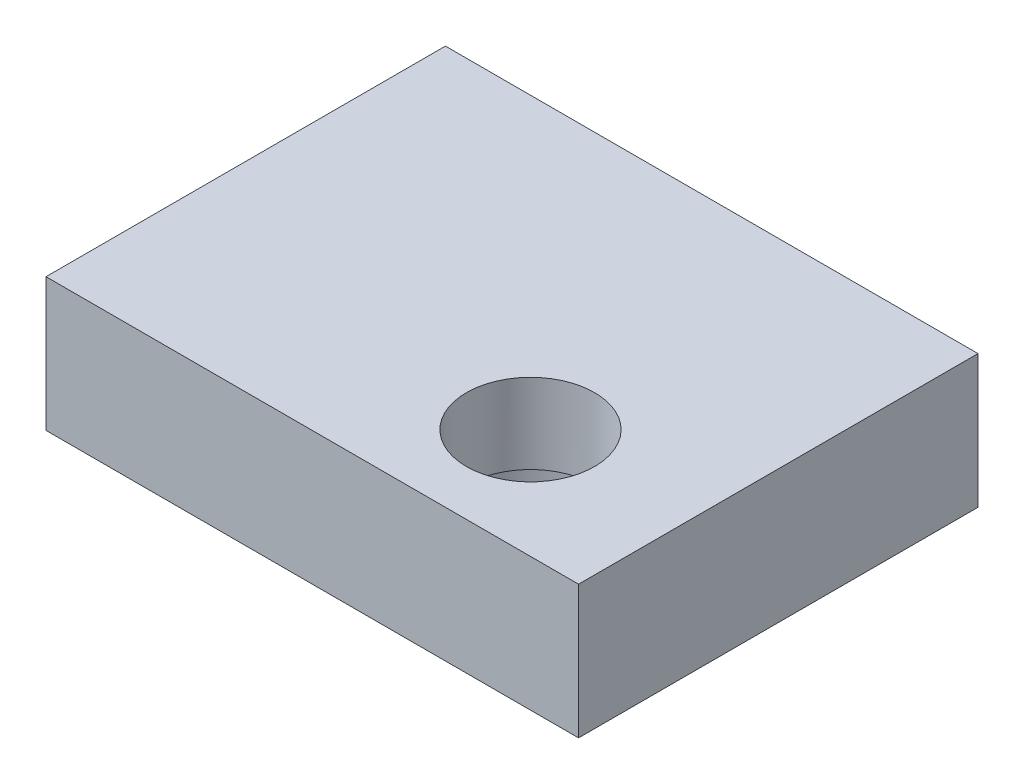
ISO-10303-21;
HEADER;
FILE_DESCRIPTION(('STEP AP214'),'2;1');
FILE_NAME('part.step','',(''),(''),'','','');
FILE_SCHEMA(('AUTOMOTIVE_DESIGN { 1 0 10303 214 1 1 1 1 }'));
ENDSEC;
DATA;
#1=APPLICATION_CONTEXT('core data for automotive mechanical design processes');
#2=APPLICATION_PROTOCOL_DEFINITION('international standard','automotive_design',2000,#1);
#3=PRODUCT_CONTEXT('',#1,'mechanical');
#4=PRODUCT('Part','Part','',(#3));
#5=PRODUCT_RELATED_PRODUCT_CATEGORY('part','',(#4));
#6=PRODUCT_DEFINITION_FORMATION('','',#4);
#7=PRODUCT_DEFINITION_CONTEXT('part definition',#1,'design');
#8=PRODUCT_DEFINITION('design','',#6,#7);
#9=PRODUCT_DEFINITION_SHAPE('','',#8);
#10=(LENGTH_UNIT() NAMED_UNIT(*) SI_UNIT(.MILLI.,.METRE.));
#11=(NAMED_UNIT(*) PLANE_ANGLE_UNIT() SI_UNIT($,.RADIAN.));
#12=(NAMED_UNIT(*) SI_UNIT($,.STERADIAN.) SOLID_ANGLE_UNIT());
#13=UNCERTAINTY_MEASURE_WITH_UNIT(LENGTH_MEASURE(1.E-05),#10,'distance_accuracy_value','');
#14=(GEOMETRIC_REPRESENTATION_CONTEXT(3) GLOBAL_UNCERTAINTY_ASSIGNED_CONTEXT((#13)) GLOBAL_UNIT_ASSIGNED_CONTEXT((#10,
#11,#12)) REPRESENTATION_CONTEXT('',''));
#15=CARTESIAN_POINT('',(0.,0.,0.));
#16=DIRECTION('',(0.,0.,1.));
#17=DIRECTION('',(1.,0.,0.));
#18=AXIS2_PLACEMENT_3D('',#15,#16,#17);
#19=CARTESIAN_POINT('',(20.,10.,15.));
#20=DIRECTION('',(-1.,0.,0.));
#21=DIRECTION('',(0.,0.,1.));
#22=AXIS2_PLACEMENT_3D('',#19,#20,#21);
#23=PLANE('',#22);
#24=DIRECTION('',(0.,0.,-1.));
#25=VECTOR('',#24,1.);
#26=CARTESIAN_POINT('',(20.,0.,15.));
#27=LINE('',#26,#25);
#28=CARTESIAN_POINT('',(20.,0.,15.));
#29=VERTEX_POINT('',#28);
#30=CARTESIAN_POINT('',(20.,0.,-15.));
#31=VERTEX_POINT('',#30);
#32=EDGE_CURVE('E113',#29,#31,#27,.T.);
#33=ORIENTED_EDGE('',*,*,#32,.T.);
#34=DIRECTION('',(0.,-1.,0.));
#35=VECTOR('',#34,1.);
#36=CARTESIAN_POINT('',(20.,10.,-15.));
#37=LINE('',#36,#35);
#38=CARTESIAN_POINT('',(20.,10.,-15.));
#39=VERTEX_POINT('',#38);
#40=EDGE_CURVE('E11',#39,#31,#37,.T.);
#41=ORIENTED_EDGE('',*,*,#40,.F.);
#42=DIRECTION('',(0.,0.,-1.));
#43=VECTOR('',#42,1.);
#44=CARTESIAN_POINT('',(20.,10.,15.));
#45=LINE('',#44,#43);
#46=CARTESIAN_POINT('',(20.,10.,15.));
#47=VERTEX_POINT('',#46);
#48=EDGE_CURVE('E96',#47,#39,#45,.T.);
#49=ORIENTED_EDGE('',*,*,#48,.F.);
#50=DIRECTION('',(0.,-1.,0.));
#51=VECTOR('',#50,1.);
#52=CARTESIAN_POINT('',(20.,10.,15.));
#53=LINE('',#52,#51);
#54=EDGE_CURVE('E109',#47,#29,#53,.T.);
#55=ORIENTED_EDGE('',*,*,#54,.T.);
#56=EDGE_LOOP('',(#33,#41,#49,#55));
#57=FACE_BOUND('',#56,.T.);
#58=ADVANCED_FACE('F43',(#57),#23,.F.);
#59=CARTESIAN_POINT('',(-20.,10.,-15.));
#60=DIRECTION('',(0.,0.,1.));
#61=DIRECTION('',(1.,0.,0.));
#62=AXIS2_PLACEMENT_3D('',#59,#60,#61);
#63=PLANE('',#62);
#64=DIRECTION('',(-1.,0.,0.));
#65=VECTOR('',#64,1.);
#66=CARTESIAN_POINT('',(-20.,0.,-15.));
#67=LINE('',#66,#65);
#68=CARTESIAN_POINT('',(-20.,0.,-15.));
#69=VERTEX_POINT('',#68);
#70=EDGE_CURVE('E101',#31,#69,#67,.T.);
#71=ORIENTED_EDGE('',*,*,#70,.T.);
#72=DIRECTION('',(0.,-1.,0.));
#73=VECTOR('',#72,1.);
#74=CARTESIAN_POINT('',(-20.,10.,-15.));
#75=LINE('',#74,#73);
#76=CARTESIAN_POINT('',(-20.,10.,-15.));
#77=VERTEX_POINT('',#76);
#78=EDGE_CURVE('E53',#77,#69,#75,.T.);
#79=ORIENTED_EDGE('',*,*,#78,.F.);
#80=DIRECTION('',(-1.,0.,0.));
#81=VECTOR('',#80,1.);
#82=CARTESIAN_POINT('',(-20.,10.,-15.));
#83=LINE('',#82,#81);
#84=EDGE_CURVE('E91',#39,#77,#83,.T.);
#85=ORIENTED_EDGE('',*,*,#84,.F.);
#86=ORIENTED_EDGE('',*,*,#40,.T.);
#87=EDGE_LOOP('',(#71,#79,#85,#86));
#88=FACE_BOUND('',#87,.T.);
#89=ADVANCED_FACE('F100',(#88),#63,.F.);
#90=CARTESIAN_POINT('',(-20.,10.,15.));
#91=DIRECTION('',(1.,0.,0.));
#92=DIRECTION('',(0.,0.,-1.));
#93=AXIS2_PLACEMENT_3D('',#90,#91,#92);
#94=PLANE('',#93);
#95=DIRECTION('',(0.,0.,1.));
#96=VECTOR('',#95,1.);
#97=CARTESIAN_POINT('',(-20.,0.,15.));
#98=LINE('',#97,#96);
#99=CARTESIAN_POINT('',(-20.,0.,15.));
#100=VERTEX_POINT('',#99);
#101=EDGE_CURVE('E78',#69,#100,#98,.T.);
#102=ORIENTED_EDGE('',*,*,#101,.T.);
#103=DIRECTION('',(0.,-1.,0.));
#104=VECTOR('',#103,1.);
#105=CARTESIAN_POINT('',(-20.,10.,15.));
#106=LINE('',#105,#104);
#107=CARTESIAN_POINT('',(-20.,10.,15.));
#108=VERTEX_POINT('',#107);
#109=EDGE_CURVE('E103',#108,#100,#106,.T.);
#110=ORIENTED_EDGE('',*,*,#109,.F.);
#111=DIRECTION('',(0.,0.,1.));
#112=VECTOR('',#111,1.);
#113=CARTESIAN_POINT('',(-20.,10.,15.));
#114=LINE('',#113,#112);
#115=EDGE_CURVE('E94',#77,#108,#114,.T.);
#116=ORIENTED_EDGE('',*,*,#115,.F.);
#117=ORIENTED_EDGE('',*,*,#78,.T.);
#118=EDGE_LOOP('',(#102,#110,#116,#117));
#119=FACE_BOUND('',#118,.T.);
#120=ADVANCED_FACE('F105',(#119),#94,.F.);
#121=CARTESIAN_POINT('',(-20.,10.,15.));
#122=DIRECTION('',(0.,0.,-1.));
#123=DIRECTION('',(-1.,0.,0.));
#124=AXIS2_PLACEMENT_3D('',#121,#122,#123);
#125=PLANE('',#124);
#126=DIRECTION('',(1.,0.,0.));
#127=VECTOR('',#126,1.);
#128=CARTESIAN_POINT('',(-20.,0.,15.));
#129=LINE('',#128,#127);
#130=EDGE_CURVE('E84',#100,#29,#129,.T.);
#131=ORIENTED_EDGE('',*,*,#130,.T.);
#132=ORIENTED_EDGE('',*,*,#54,.F.);
#133=DIRECTION('',(1.,0.,0.));
#134=VECTOR('',#133,1.);
#135=CARTESIAN_POINT('',(-20.,10.,15.));
#136=LINE('',#135,#134);
#137=EDGE_CURVE('E61',#108,#47,#136,.T.);
#138=ORIENTED_EDGE('',*,*,#137,.F.);
#139=ORIENTED_EDGE('',*,*,#109,.T.);
#140=EDGE_LOOP('',(#131,#132,#138,#139));
#141=FACE_BOUND('',#140,.T.);
#142=ADVANCED_FACE('F127',(#141),#125,.F.);
#143=CARTESIAN_POINT('',(0.,10.,0.));
#144=DIRECTION('',(0.,-1.,0.));
#145=DIRECTION('',(0.,0.,-1.));
#146=AXIS2_PLACEMENT_3D('',#143,#144,#145);
#147=PLANE('',#146);
#148=CARTESIAN_POINT('',(8.14,10.,6.75));
#149=DIRECTION('',(0.,1.,0.));
#150=DIRECTION('',(0.,0.,1.));
#151=AXIS2_PLACEMENT_3D('',#148,#149,#150);
#152=CIRCLE('',#151,4.8125);
#153=CARTESIAN_POINT('',(8.14,10.,11.5625));
#154=VERTEX_POINT('',#153);
#155=EDGE_CURVE('E165',#154,#154,#152,.T.);
#156=ORIENTED_EDGE('',*,*,#155,.F.);
#157=EDGE_LOOP('',(#156));
#158=FACE_BOUND('',#157,.T.);
#159=ORIENTED_EDGE('',*,*,#48,.T.);
#160=ORIENTED_EDGE('',*,*,#84,.T.);
#161=ORIENTED_EDGE('',*,*,#115,.T.);
#162=ORIENTED_EDGE('',*,*,#137,.T.);
#163=EDGE_LOOP('',(#159,#160,#161,#162));
#164=FACE_BOUND('',#163,.T.);
#165=ADVANCED_FACE('F92',(#158,#164),#147,.F.);
#166=CARTESIAN_POINT('',(0.,0.,0.));
#167=DIRECTION('',(0.,-1.,0.));
#168=DIRECTION('',(0.,0.,-1.));
#169=AXIS2_PLACEMENT_3D('',#166,#167,#168);
#170=PLANE('',#169);
#171=CARTESIAN_POINT('',(8.14,0.,6.75));
#172=DIRECTION('',(0.,-1.,0.));
#173=DIRECTION('',(0.,0.,-1.));
#174=AXIS2_PLACEMENT_3D('',#171,#172,#173);
#175=CIRCLE('',#174,6.25);
#176=CARTESIAN_POINT('',(8.14,0.,0.5));
#177=VERTEX_POINT('',#176);
#178=EDGE_CURVE('E146',#177,#177,#175,.T.);
#179=ORIENTED_EDGE('',*,*,#178,.F.);
#180=EDGE_LOOP('',(#179));
#181=FACE_BOUND('',#180,.T.);
#182=CARTESIAN_POINT('',(13.3333333333333,0.,-9.99999999999999));
#183=DIRECTION('',(0.,-1.,0.));
#184=DIRECTION('',(0.,0.,-1.));
#185=AXIS2_PLACEMENT_3D('',#182,#183,#184);
#186=CIRCLE('',#185,1.55);
#187=CARTESIAN_POINT('',(13.3333333333333,0.,-11.55));
#188=VERTEX_POINT('',#187);
#189=EDGE_CURVE('E154',#188,#188,#186,.T.);
#190=ORIENTED_EDGE('',*,*,#189,.F.);
#191=EDGE_LOOP('',(#190));
#192=FACE_BOUND('',#191,.T.);
#193=CARTESIAN_POINT('',(-13.3333333333333,0.,-9.99999999999999));
#194=DIRECTION('',(0.,-1.,0.));
#195=DIRECTION('',(0.,0.,1.));
#196=AXIS2_PLACEMENT_3D('',#193,#194,#195);
#197=CIRCLE('',#196,1.55);
#198=CARTESIAN_POINT('',(-13.3333333333333,0.,-8.44999999999999));
#199=VERTEX_POINT('',#198);
#200=EDGE_CURVE('E138',#199,#199,#197,.T.);
#201=ORIENTED_EDGE('',*,*,#200,.F.);
#202=EDGE_LOOP('',(#201));
#203=FACE_BOUND('',#202,.T.);
#204=CARTESIAN_POINT('',(-13.3333333333333,0.,10.));
#205=DIRECTION('',(0.,-1.,0.));
#206=DIRECTION('',(0.,0.,-1.));
#207=AXIS2_PLACEMENT_3D('',#204,#205,#206);
#208=CIRCLE('',#207,1.55);
#209=CARTESIAN_POINT('',(-13.3333333333333,0.,8.45));
#210=VERTEX_POINT('',#209);
#211=EDGE_CURVE('E134',#210,#210,#208,.T.);
#212=ORIENTED_EDGE('',*,*,#211,.F.);
#213=EDGE_LOOP('',(#212));
#214=FACE_BOUND('',#213,.T.);
#215=ORIENTED_EDGE('',*,*,#32,.F.);
#216=ORIENTED_EDGE('',*,*,#130,.F.);
#217=ORIENTED_EDGE('',*,*,#101,.F.);
#218=ORIENTED_EDGE('',*,*,#70,.F.);
#219=EDGE_LOOP('',(#215,#216,#217,#218));
#220=FACE_BOUND('',#219,.T.);
#221=ADVANCED_FACE('F130',(#181,#192,#203,#214,#220),#170,.T.);
#222=CARTESIAN_POINT('',(-13.3333333333333,4.,10.));
#223=DIRECTION('',(0.,-1.,0.));
#224=DIRECTION('',(0.,0.,-1.));
#225=AXIS2_PLACEMENT_3D('',#222,#223,#224);
#226=CYLINDRICAL_SURFACE('',#225,1.55);
#227=CARTESIAN_POINT('',(-13.3333333333333,4.,10.));
#228=DIRECTION('',(0.,-1.,0.));
#229=DIRECTION('',(0.,0.,-1.));
#230=AXIS2_PLACEMENT_3D('',#227,#228,#229);
#231=CIRCLE('',#230,1.55);
#232=CARTESIAN_POINT('',(-13.3333333333333,4.,8.45));
#233=VERTEX_POINT('',#232);
#234=EDGE_CURVE('E117',#233,#233,#231,.T.);
#235=ORIENTED_EDGE('',*,*,#234,.F.);
#236=EDGE_LOOP('',(#235));
#237=FACE_BOUND('',#236,.T.);
#238=ORIENTED_EDGE('',*,*,#211,.T.);
#239=EDGE_LOOP('',(#238));
#240=FACE_BOUND('',#239,.T.);
#241=ADVANCED_FACE('F191',(#237,#240),#226,.F.);
#242=CARTESIAN_POINT('',(-13.3333333333333,4.,10.));
#243=DIRECTION('',(0.,-1.,0.));
#244=DIRECTION('',(0.,0.,-1.));
#245=AXIS2_PLACEMENT_3D('',#242,#243,#244);
#246=PLANE('',#245);
#247=ORIENTED_EDGE('',*,*,#234,.T.);
#248=EDGE_LOOP('',(#247));
#249=FACE_BOUND('',#248,.T.);
#250=ADVANCED_FACE('F200',(#249),#246,.T.);
#251=CARTESIAN_POINT('',(-13.3333333333333,4.,-9.99999999999999));
#252=DIRECTION('',(0.,-1.,0.));
#253=DIRECTION('',(0.,0.,-1.));
#254=AXIS2_PLACEMENT_3D('',#251,#252,#253);
#255=CYLINDRICAL_SURFACE('',#254,1.55);
#256=CARTESIAN_POINT('',(-13.3333333333333,4.,-9.99999999999999));
#257=DIRECTION('',(0.,-1.,0.));
#258=DIRECTION('',(0.,0.,1.));
#259=AXIS2_PLACEMENT_3D('',#256,#257,#258);
#260=CIRCLE('',#259,1.55);
#261=CARTESIAN_POINT('',(-13.3333333333333,4.,-8.44999999999999));
#262=VERTEX_POINT('',#261);
#263=EDGE_CURVE('E158',#262,#262,#260,.T.);
#264=ORIENTED_EDGE('',*,*,#263,.F.);
#265=EDGE_LOOP('',(#264));
#266=FACE_BOUND('',#265,.T.);
#267=ORIENTED_EDGE('',*,*,#200,.T.);
#268=EDGE_LOOP('',(#267));
#269=FACE_BOUND('',#268,.T.);
#270=ADVANCED_FACE('F206',(#266,#269),#255,.F.);
#271=CARTESIAN_POINT('',(-13.3333333333333,4.,-9.99999999999999));
#272=DIRECTION('',(0.,1.,0.));
#273=DIRECTION('',(0.,0.,1.));
#274=AXIS2_PLACEMENT_3D('',#271,#272,#273);
#275=PLANE('',#274);
#276=ORIENTED_EDGE('',*,*,#263,.T.);
#277=EDGE_LOOP('',(#276));
#278=FACE_BOUND('',#277,.T.);
#279=ADVANCED_FACE('F258',(#278),#275,.F.);
#280=CARTESIAN_POINT('',(13.3333333333333,4.,-9.99999999999999));
#281=DIRECTION('',(0.,-1.,0.));
#282=DIRECTION('',(0.,0.,-1.));
#283=AXIS2_PLACEMENT_3D('',#280,#281,#282);
#284=CYLINDRICAL_SURFACE('',#283,1.55);
#285=CARTESIAN_POINT('',(13.3333333333333,4.,-9.99999999999999));
#286=DIRECTION('',(0.,-1.,0.));
#287=DIRECTION('',(0.,0.,-1.));
#288=AXIS2_PLACEMENT_3D('',#285,#286,#287);
#289=CIRCLE('',#288,1.55);
#290=CARTESIAN_POINT('',(13.3333333333333,4.,-11.55));
#291=VERTEX_POINT('',#290);
#292=EDGE_CURVE('E150',#291,#291,#289,.T.);
#293=ORIENTED_EDGE('',*,*,#292,.F.);
#294=EDGE_LOOP('',(#293));
#295=FACE_BOUND('',#294,.T.);
#296=ORIENTED_EDGE('',*,*,#189,.T.);
#297=EDGE_LOOP('',(#296));
#298=FACE_BOUND('',#297,.T.);
#299=ADVANCED_FACE('F269',(#295,#298),#284,.F.);
#300=CARTESIAN_POINT('',(13.3333333333333,4.,-9.99999999999999));
#301=DIRECTION('',(0.,-1.,0.));
#302=DIRECTION('',(0.,0.,-1.));
#303=AXIS2_PLACEMENT_3D('',#300,#301,#302);
#304=PLANE('',#303);
#305=ORIENTED_EDGE('',*,*,#292,.T.);
#306=EDGE_LOOP('',(#305));
#307=FACE_BOUND('',#306,.T.);
#308=ADVANCED_FACE('F185',(#307),#304,.T.);
#309=CARTESIAN_POINT('',(8.14,4.,6.75));
#310=DIRECTION('',(0.,-1.,0.));
#311=DIRECTION('',(0.,0.,-1.));
#312=AXIS2_PLACEMENT_3D('',#309,#310,#311);
#313=CYLINDRICAL_SURFACE('',#312,6.25);
#314=CARTESIAN_POINT('',(8.14,4.,6.75));
#315=DIRECTION('',(0.,-1.,0.));
#316=DIRECTION('',(0.,0.,-1.));
#317=AXIS2_PLACEMENT_3D('',#314,#315,#316);
#318=CIRCLE('',#317,6.25);
#319=CARTESIAN_POINT('',(8.14,4.,0.5));
#320=VERTEX_POINT('',#319);
#321=EDGE_CURVE('E142',#320,#320,#318,.T.);
#322=ORIENTED_EDGE('',*,*,#321,.F.);
#323=EDGE_LOOP('',(#322));
#324=FACE_BOUND('',#323,.T.);
#325=ORIENTED_EDGE('',*,*,#178,.T.);
#326=EDGE_LOOP('',(#325));
#327=FACE_BOUND('',#326,.T.);
#328=ADVANCED_FACE('F179',(#324,#327),#313,.F.);
#329=CARTESIAN_POINT('',(8.14,4.,6.75));
#330=DIRECTION('',(0.,-1.,0.));
#331=DIRECTION('',(0.,0.,-1.));
#332=AXIS2_PLACEMENT_3D('',#329,#330,#331);
#333=PLANE('',#332);
#334=CARTESIAN_POINT('',(8.14,4.,6.75));
#335=DIRECTION('',(0.,-1.,0.));
#336=DIRECTION('',(0.,0.,-1.));
#337=AXIS2_PLACEMENT_3D('',#334,#335,#336);
#338=CIRCLE('',#337,4.8125);
#339=CARTESIAN_POINT('',(8.14,4.,1.9375));
#340=VERTEX_POINT('',#339);
#341=EDGE_CURVE('E46',#340,#340,#338,.T.);
#342=ORIENTED_EDGE('',*,*,#341,.F.);
#343=EDGE_LOOP('',(#342));
#344=FACE_BOUND('',#343,.T.);
#345=ORIENTED_EDGE('',*,*,#321,.T.);
#346=EDGE_LOOP('',(#345));
#347=FACE_BOUND('',#346,.T.);
#348=ADVANCED_FACE('F176',(#344,#347),#333,.T.);
#349=CARTESIAN_POINT('',(8.14,-13.611805537841,6.75));
#350=DIRECTION('',(0.,1.,0.));
#351=DIRECTION('',(0.,0.,1.));
#352=AXIS2_PLACEMENT_3D('',#349,#350,#351);
#353=CYLINDRICAL_SURFACE('',#352,4.8125);
#354=ORIENTED_EDGE('',*,*,#341,.T.);
#355=EDGE_LOOP('',(#354));
#356=FACE_BOUND('',#355,.T.);
#357=ORIENTED_EDGE('',*,*,#155,.T.);
#358=EDGE_LOOP('',(#357));
#359=FACE_BOUND('',#358,.T.);
#360=ADVANCED_FACE('F174',(#356,#359),#353,.F.);
#361=CLOSED_SHELL('',(#58,#89,#120,#142,#165,#221,#241,#250,#270,#279,#299,#308,#328,#348,#360));
#362=MANIFOLD_SOLID_BREP('B2',#361);
#363=ADVANCED_BREP_SHAPE_REPRESENTATION('',(#18,#362),#14);
#364=SHAPE_DEFINITION_REPRESENTATION(#9,#363);
ENDSEC;
END-ISO-10303-21;
